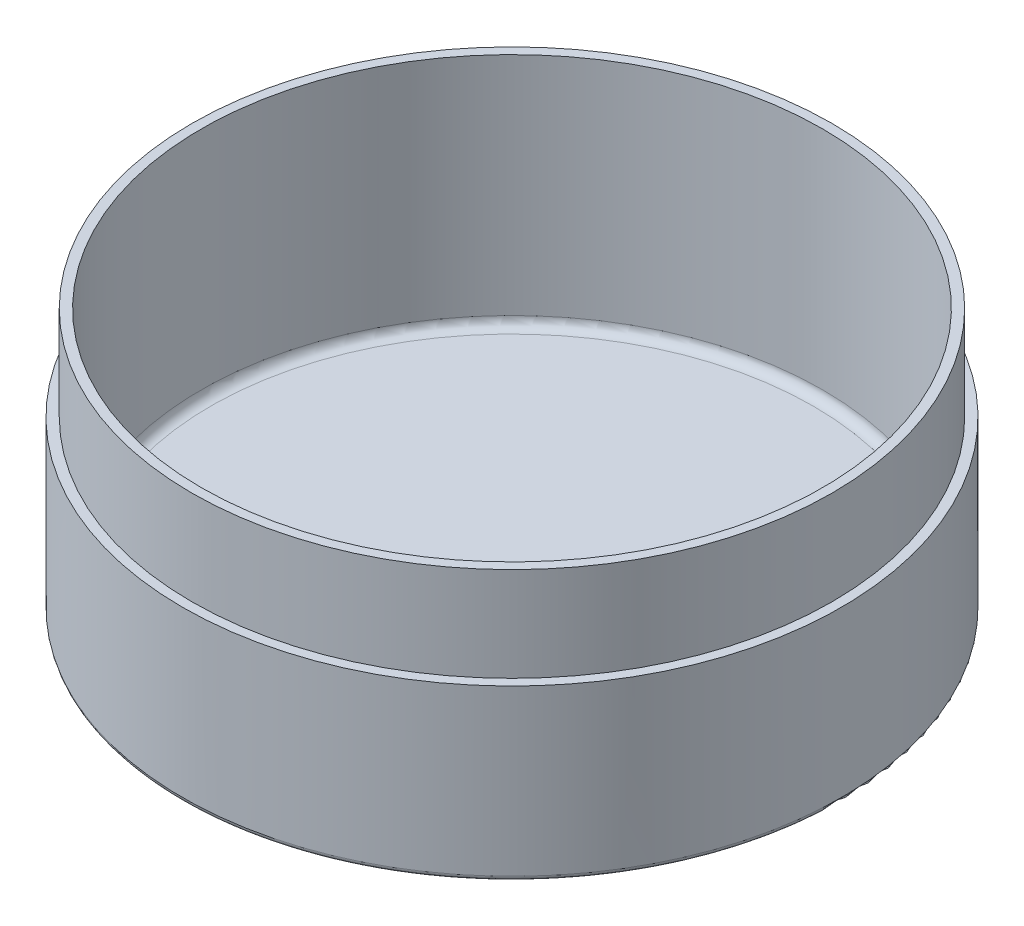
ISO-10303-21;
HEADER;
FILE_DESCRIPTION(('STEP AP214'),'2;1');
FILE_NAME('part.step','',(''),(''),'','','');
FILE_SCHEMA(('AUTOMOTIVE_DESIGN { 1 0 10303 214 1 1 1 1 }'));
ENDSEC;
DATA;
#1=APPLICATION_CONTEXT('core data for automotive mechanical design processes');
#2=APPLICATION_PROTOCOL_DEFINITION('international standard','automotive_design',2000,#1);
#3=PRODUCT_CONTEXT('',#1,'mechanical');
#4=PRODUCT('Part','Part','',(#3));
#5=PRODUCT_RELATED_PRODUCT_CATEGORY('part','',(#4));
#6=PRODUCT_DEFINITION_FORMATION('','',#4);
#7=PRODUCT_DEFINITION_CONTEXT('part definition',#1,'design');
#8=PRODUCT_DEFINITION('design','',#6,#7);
#9=PRODUCT_DEFINITION_SHAPE('','',#8);
#10=(LENGTH_UNIT() NAMED_UNIT(*) SI_UNIT(.MILLI.,.METRE.));
#11=(NAMED_UNIT(*) PLANE_ANGLE_UNIT() SI_UNIT($,.RADIAN.));
#12=(NAMED_UNIT(*) SI_UNIT($,.STERADIAN.) SOLID_ANGLE_UNIT());
#13=UNCERTAINTY_MEASURE_WITH_UNIT(LENGTH_MEASURE(1.E-05),#10,'distance_accuracy_value','');
#14=(GEOMETRIC_REPRESENTATION_CONTEXT(3) GLOBAL_UNCERTAINTY_ASSIGNED_CONTEXT((#13)) GLOBAL_UNIT_ASSIGNED_CONTEXT((#10,
#11,#12)) REPRESENTATION_CONTEXT('',''));
#15=CARTESIAN_POINT('',(0.,0.,0.));
#16=DIRECTION('',(0.,0.,1.));
#17=DIRECTION('',(1.,0.,0.));
#18=AXIS2_PLACEMENT_3D('',#15,#16,#17);
#19=CARTESIAN_POINT('',(0.,25.,0.));
#20=DIRECTION('',(0.,1.,0.));
#21=DIRECTION('',(0.,0.,1.));
#22=AXIS2_PLACEMENT_3D('',#19,#20,#21);
#23=PLANE('',#22);
#24=CARTESIAN_POINT('',(0.,25.,0.));
#25=DIRECTION('',(0.,1.,0.));
#26=DIRECTION('',(0.,0.,1.));
#27=AXIS2_PLACEMENT_3D('',#24,#25,#26);
#28=CIRCLE('',#27,33.);
#29=CARTESIAN_POINT('',(0.,25.,33.));
#30=VERTEX_POINT('',#29);
#31=EDGE_CURVE('E57',#30,#30,#28,.T.);
#32=ORIENTED_EDGE('',*,*,#31,.F.);
#33=EDGE_LOOP('',(#32));
#34=FACE_BOUND('',#33,.T.);
#35=CARTESIAN_POINT('',(0.,25.,0.));
#36=DIRECTION('',(0.,1.,0.));
#37=DIRECTION('',(0.,0.,1.));
#38=AXIS2_PLACEMENT_3D('',#35,#36,#37);
#39=CIRCLE('',#38,34.);
#40=CARTESIAN_POINT('',(0.,25.,34.));
#41=VERTEX_POINT('',#40);
#42=EDGE_CURVE('E64',#41,#41,#39,.T.);
#43=ORIENTED_EDGE('',*,*,#42,.T.);
#44=EDGE_LOOP('',(#43));
#45=FACE_BOUND('',#44,.T.);
#46=ADVANCED_FACE('F37',(#34,#45),#23,.T.);
#47=CARTESIAN_POINT('',(0.,25.,0.));
#48=DIRECTION('',(0.,-1.,0.));
#49=DIRECTION('',(0.,0.,-1.));
#50=AXIS2_PLACEMENT_3D('',#47,#48,#49);
#51=CYLINDRICAL_SURFACE('',#50,33.);
#52=CARTESIAN_POINT('',(0.,1.,0.));
#53=DIRECTION('',(0.,-1.,0.));
#54=DIRECTION('',(0.,0.,-1.));
#55=AXIS2_PLACEMENT_3D('',#52,#53,#54);
#56=CIRCLE('',#55,33.);
#57=CARTESIAN_POINT('',(0.,1.,-33.));
#58=VERTEX_POINT('',#57);
#59=EDGE_CURVE('E48',#58,#58,#56,.T.);
#60=ORIENTED_EDGE('',*,*,#59,.T.);
#61=EDGE_LOOP('',(#60));
#62=FACE_BOUND('',#61,.T.);
#63=ORIENTED_EDGE('',*,*,#31,.T.);
#64=EDGE_LOOP('',(#63));
#65=FACE_BOUND('',#64,.T.);
#66=ADVANCED_FACE('F94',(#62,#65),#51,.F.);
#67=CARTESIAN_POINT('',(0.,0.,0.));
#68=DIRECTION('',(0.,-1.,0.));
#69=DIRECTION('',(0.,0.,-1.));
#70=AXIS2_PLACEMENT_3D('',#67,#68,#69);
#71=PLANE('',#70);
#72=CARTESIAN_POINT('',(0.,0.,0.));
#73=DIRECTION('',(0.,-1.,0.));
#74=DIRECTION('',(0.,0.,-1.));
#75=AXIS2_PLACEMENT_3D('',#72,#73,#74);
#76=CIRCLE('',#75,32.);
#77=CARTESIAN_POINT('',(0.,0.,-32.));
#78=VERTEX_POINT('',#77);
#79=EDGE_CURVE('E52',#78,#78,#76,.F.);
#80=ORIENTED_EDGE('',*,*,#79,.T.);
#81=EDGE_LOOP('',(#80));
#82=FACE_BOUND('',#81,.T.);
#83=ADVANCED_FACE('F76',(#82),#71,.F.);
#84=CARTESIAN_POINT('',(0.,15.,0.));
#85=DIRECTION('',(0.,1.,0.));
#86=DIRECTION('',(0.,0.,1.));
#87=AXIS2_PLACEMENT_3D('',#84,#85,#86);
#88=PLANE('',#87);
#89=CARTESIAN_POINT('',(0.,15.,0.));
#90=DIRECTION('',(0.,1.,0.));
#91=DIRECTION('',(0.,0.,1.));
#92=AXIS2_PLACEMENT_3D('',#89,#90,#91);
#93=CIRCLE('',#92,34.);
#94=CARTESIAN_POINT('',(0.,15.,34.));
#95=VERTEX_POINT('',#94);
#96=EDGE_CURVE('E63',#95,#95,#93,.T.);
#97=ORIENTED_EDGE('',*,*,#96,.F.);
#98=EDGE_LOOP('',(#97));
#99=FACE_BOUND('',#98,.T.);
#100=CARTESIAN_POINT('',(0.,15.,0.));
#101=DIRECTION('',(0.,1.,0.));
#102=DIRECTION('',(0.,0.,1.));
#103=AXIS2_PLACEMENT_3D('',#100,#101,#102);
#104=CIRCLE('',#103,35.);
#105=CARTESIAN_POINT('',(0.,15.,35.));
#106=VERTEX_POINT('',#105);
#107=EDGE_CURVE('E60',#106,#106,#104,.T.);
#108=ORIENTED_EDGE('',*,*,#107,.T.);
#109=EDGE_LOOP('',(#108));
#110=FACE_BOUND('',#109,.T.);
#111=ADVANCED_FACE('F73',(#99,#110),#88,.T.);
#112=CARTESIAN_POINT('',(0.,15.,0.));
#113=DIRECTION('',(0.,1.,0.));
#114=DIRECTION('',(0.,0.,1.));
#115=AXIS2_PLACEMENT_3D('',#112,#113,#114);
#116=CYLINDRICAL_SURFACE('',#115,34.);
#117=ORIENTED_EDGE('',*,*,#96,.T.);
#118=EDGE_LOOP('',(#117));
#119=FACE_BOUND('',#118,.T.);
#120=ORIENTED_EDGE('',*,*,#42,.F.);
#121=EDGE_LOOP('',(#120));
#122=FACE_BOUND('',#121,.T.);
#123=ADVANCED_FACE('F70',(#119,#122),#116,.T.);
#124=CARTESIAN_POINT('',(0.,-3.,0.));
#125=DIRECTION('',(0.,-1.,0.));
#126=DIRECTION('',(0.,0.,-1.));
#127=AXIS2_PLACEMENT_3D('',#124,#125,#126);
#128=PLANE('',#127);
#129=CARTESIAN_POINT('',(0.,-3.,0.));
#130=DIRECTION('',(0.,-1.,0.));
#131=DIRECTION('',(0.,0.,-1.));
#132=AXIS2_PLACEMENT_3D('',#129,#130,#131);
#133=CIRCLE('',#132,34.5);
#134=CARTESIAN_POINT('',(0.,-3.,-34.5));
#135=VERTEX_POINT('',#134);
#136=EDGE_CURVE('E44',#135,#135,#133,.T.);
#137=ORIENTED_EDGE('',*,*,#136,.T.);
#138=EDGE_LOOP('',(#137));
#139=FACE_BOUND('',#138,.T.);
#140=ADVANCED_FACE('F83',(#139),#128,.T.);
#141=CARTESIAN_POINT('',(0.,25.,0.));
#142=DIRECTION('',(0.,-1.,0.));
#143=DIRECTION('',(0.,0.,-1.));
#144=AXIS2_PLACEMENT_3D('',#141,#142,#143);
#145=CYLINDRICAL_SURFACE('',#144,35.);
#146=CARTESIAN_POINT('',(0.,-2.5,0.));
#147=DIRECTION('',(0.,-1.,0.));
#148=DIRECTION('',(0.,0.,-1.));
#149=AXIS2_PLACEMENT_3D('',#146,#147,#148);
#150=CIRCLE('',#149,35.);
#151=CARTESIAN_POINT('',(0.,-2.5,-35.));
#152=VERTEX_POINT('',#151);
#153=EDGE_CURVE('E10',#152,#152,#150,.F.);
#154=ORIENTED_EDGE('',*,*,#153,.T.);
#155=EDGE_LOOP('',(#154));
#156=FACE_BOUND('',#155,.T.);
#157=ORIENTED_EDGE('',*,*,#107,.F.);
#158=EDGE_LOOP('',(#157));
#159=FACE_BOUND('',#158,.T.);
#160=ADVANCED_FACE('F80',(#156,#159),#145,.T.);
#161=CARTESIAN_POINT('',(0.,1.,0.));
#162=DIRECTION('',(0.,-1.,0.));
#163=DIRECTION('',(0.,0.,-1.));
#164=AXIS2_PLACEMENT_3D('',#161,#162,#163);
#165=TOROIDAL_SURFACE('',#164,32.,1.);
#166=ORIENTED_EDGE('',*,*,#59,.F.);
#167=EDGE_LOOP('',(#166));
#168=FACE_BOUND('',#167,.T.);
#169=ORIENTED_EDGE('',*,*,#79,.F.);
#170=EDGE_LOOP('',(#169));
#171=FACE_BOUND('',#170,.T.);
#172=ADVANCED_FACE('F82',(#168,#171),#165,.F.);
#173=CARTESIAN_POINT('',(0.,-2.5,0.));
#174=DIRECTION('',(0.,-1.,0.));
#175=DIRECTION('',(0.,0.,-1.));
#176=AXIS2_PLACEMENT_3D('',#173,#174,#175);
#177=TOROIDAL_SURFACE('',#176,34.5,0.5);
#178=ORIENTED_EDGE('',*,*,#153,.F.);
#179=EDGE_LOOP('',(#178));
#180=FACE_BOUND('',#179,.T.);
#181=ORIENTED_EDGE('',*,*,#136,.F.);
#182=EDGE_LOOP('',(#181));
#183=FACE_BOUND('',#182,.T.);
#184=ADVANCED_FACE('F39',(#180,#183),#177,.T.);
#185=CLOSED_SHELL('',(#46,#66,#83,#111,#123,#140,#160,#172,#184));
#186=MANIFOLD_SOLID_BREP('B2',#185);
#187=ADVANCED_BREP_SHAPE_REPRESENTATION('',(#18,#186),#14);
#188=SHAPE_DEFINITION_REPRESENTATION(#9,#187);
ENDSEC;
END-ISO-10303-21;
